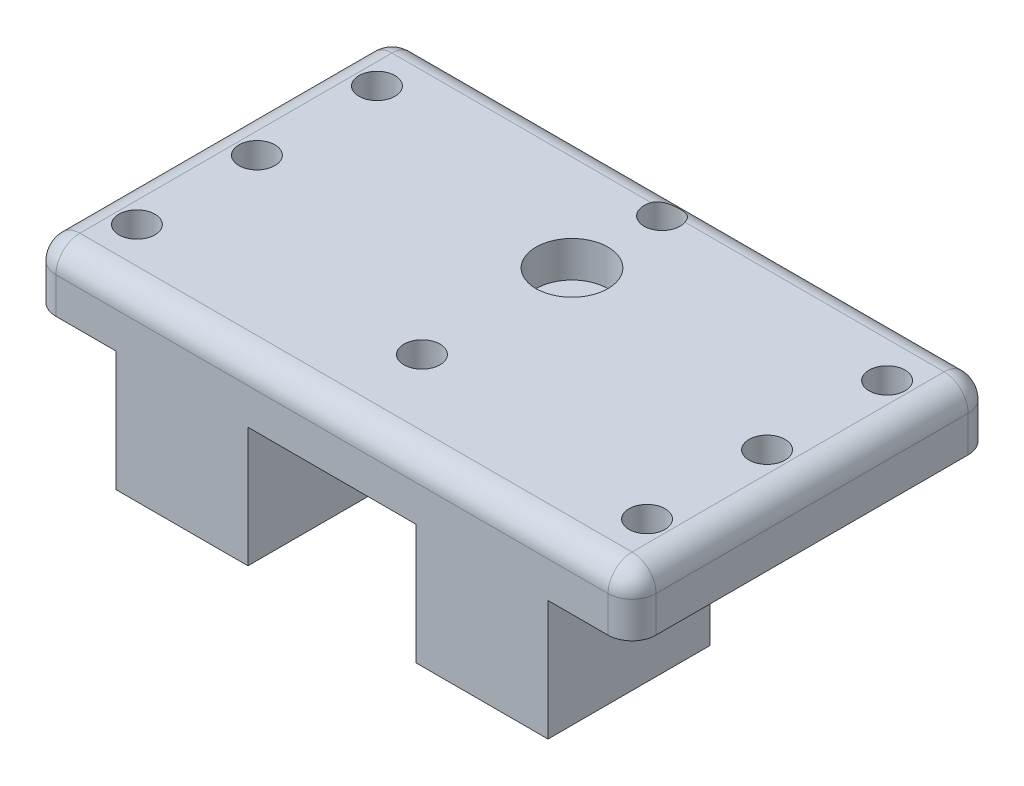
ISO-10303-21;
HEADER;
FILE_DESCRIPTION(('STEP AP214'),'2;1');
FILE_NAME('part.step','',(''),(''),'','','');
FILE_SCHEMA(('AUTOMOTIVE_DESIGN { 1 0 10303 214 1 1 1 1 }'));
ENDSEC;
DATA;
#1=APPLICATION_CONTEXT('core data for automotive mechanical design processes');
#2=APPLICATION_PROTOCOL_DEFINITION('international standard','automotive_design',2000,#1);
#3=PRODUCT_CONTEXT('',#1,'mechanical');
#4=PRODUCT('Part','Part','',(#3));
#5=PRODUCT_RELATED_PRODUCT_CATEGORY('part','',(#4));
#6=PRODUCT_DEFINITION_FORMATION('','',#4);
#7=PRODUCT_DEFINITION_CONTEXT('part definition',#1,'design');
#8=PRODUCT_DEFINITION('design','',#6,#7);
#9=PRODUCT_DEFINITION_SHAPE('','',#8);
#10=(LENGTH_UNIT() NAMED_UNIT(*) SI_UNIT(.MILLI.,.METRE.));
#11=(NAMED_UNIT(*) PLANE_ANGLE_UNIT() SI_UNIT($,.RADIAN.));
#12=(NAMED_UNIT(*) SI_UNIT($,.STERADIAN.) SOLID_ANGLE_UNIT());
#13=UNCERTAINTY_MEASURE_WITH_UNIT(LENGTH_MEASURE(1.E-05),#10,'distance_accuracy_value','');
#14=(GEOMETRIC_REPRESENTATION_CONTEXT(3) GLOBAL_UNCERTAINTY_ASSIGNED_CONTEXT((#13)) GLOBAL_UNIT_ASSIGNED_CONTEXT((#10,
#11,#12)) REPRESENTATION_CONTEXT('',''));
#15=CARTESIAN_POINT('',(0.,0.,0.));
#16=DIRECTION('',(0.,0.,1.));
#17=DIRECTION('',(1.,0.,0.));
#18=AXIS2_PLACEMENT_3D('',#15,#16,#17);
#19=CARTESIAN_POINT('',(0.,0.,-5.));
#20=DIRECTION('',(0.,1.,0.));
#21=DIRECTION('',(0.,0.,1.));
#22=AXIS2_PLACEMENT_3D('',#19,#20,#21);
#23=CYLINDRICAL_SURFACE('',#22,1.25);
#24=CARTESIAN_POINT('',(0.,0.,-5.));
#25=DIRECTION('',(0.,1.,0.));
#26=DIRECTION('',(0.,0.,1.));
#27=AXIS2_PLACEMENT_3D('',#24,#25,#26);
#28=CIRCLE('',#27,1.25);
#29=CARTESIAN_POINT('',(0.,0.,-3.75));
#30=VERTEX_POINT('',#29);
#31=EDGE_CURVE('E429',#30,#30,#28,.T.);
#32=ORIENTED_EDGE('',*,*,#31,.F.);
#33=EDGE_LOOP('',(#32));
#34=FACE_BOUND('',#33,.T.);
#35=CARTESIAN_POINT('',(0.,2.,-5.));
#36=DIRECTION('',(0.,1.,0.));
#37=DIRECTION('',(0.,0.,1.));
#38=AXIS2_PLACEMENT_3D('',#35,#36,#37);
#39=CIRCLE('',#38,1.25);
#40=CARTESIAN_POINT('',(0.,2.,-3.75));
#41=VERTEX_POINT('',#40);
#42=EDGE_CURVE('E45',#41,#41,#39,.F.);
#43=ORIENTED_EDGE('',*,*,#42,.F.);
#44=EDGE_LOOP('',(#43));
#45=FACE_BOUND('',#44,.T.);
#46=ADVANCED_FACE('F41',(#34,#45),#23,.F.);
#47=CARTESIAN_POINT('',(0.,0.,0.));
#48=DIRECTION('',(0.,1.,0.));
#49=DIRECTION('',(0.,0.,1.));
#50=AXIS2_PLACEMENT_3D('',#47,#48,#49);
#51=PLANE('',#50);
#52=CARTESIAN_POINT('',(-21.25,0.,-9.99999999999999));
#53=DIRECTION('',(0.,1.,0.));
#54=DIRECTION('',(0.,0.,1.));
#55=AXIS2_PLACEMENT_3D('',#52,#53,#54);
#56=CIRCLE('',#55,1.5);
#57=CARTESIAN_POINT('',(-21.25,0.,-8.49999999999999));
#58=VERTEX_POINT('',#57);
#59=EDGE_CURVE('E380',#58,#58,#56,.T.);
#60=ORIENTED_EDGE('',*,*,#59,.T.);
#61=EDGE_LOOP('',(#60));
#62=FACE_BOUND('',#61,.T.);
#63=CARTESIAN_POINT('',(21.25,0.,10.));
#64=DIRECTION('',(0.,1.,0.));
#65=DIRECTION('',(0.,0.,1.));
#66=AXIS2_PLACEMENT_3D('',#63,#64,#65);
#67=CIRCLE('',#66,1.5);
#68=CARTESIAN_POINT('',(21.25,0.,11.5));
#69=VERTEX_POINT('',#68);
#70=EDGE_CURVE('E377',#69,#69,#67,.T.);
#71=ORIENTED_EDGE('',*,*,#70,.T.);
#72=EDGE_LOOP('',(#71));
#73=FACE_BOUND('',#72,.T.);
#74=CARTESIAN_POINT('',(21.25,0.,-9.99999999999999));
#75=DIRECTION('',(0.,1.,0.));
#76=DIRECTION('',(0.,0.,1.));
#77=AXIS2_PLACEMENT_3D('',#74,#75,#76);
#78=CIRCLE('',#77,1.5);
#79=CARTESIAN_POINT('',(21.25,0.,-8.49999999999999));
#80=VERTEX_POINT('',#79);
#81=EDGE_CURVE('E374',#80,#80,#78,.T.);
#82=ORIENTED_EDGE('',*,*,#81,.T.);
#83=EDGE_LOOP('',(#82));
#84=FACE_BOUND('',#83,.T.);
#85=CARTESIAN_POINT('',(-21.25,0.,10.));
#86=DIRECTION('',(0.,1.,0.));
#87=DIRECTION('',(0.,0.,1.));
#88=AXIS2_PLACEMENT_3D('',#85,#86,#87);
#89=CIRCLE('',#88,1.5);
#90=CARTESIAN_POINT('',(-21.25,0.,11.5));
#91=VERTEX_POINT('',#90);
#92=EDGE_CURVE('E371',#91,#91,#89,.T.);
#93=ORIENTED_EDGE('',*,*,#92,.T.);
#94=EDGE_LOOP('',(#93));
#95=FACE_BOUND('',#94,.T.);
#96=CARTESIAN_POINT('',(-21.25,0.,0.));
#97=DIRECTION('',(0.,-1.,0.));
#98=DIRECTION('',(0.,0.,-1.));
#99=AXIS2_PLACEMENT_3D('',#96,#97,#98);
#100=CIRCLE('',#99,1.5);
#101=CARTESIAN_POINT('',(-21.25,0.,-1.5));
#102=VERTEX_POINT('',#101);
#103=EDGE_CURVE('E430',#102,#102,#100,.T.);
#104=ORIENTED_EDGE('',*,*,#103,.F.);
#105=EDGE_LOOP('',(#104));
#106=FACE_BOUND('',#105,.T.);
#107=CARTESIAN_POINT('',(0.,0.,7.5));
#108=DIRECTION('',(0.,-1.,0.));
#109=DIRECTION('',(0.,0.,-1.));
#110=AXIS2_PLACEMENT_3D('',#107,#108,#109);
#111=CIRCLE('',#110,1.5);
#112=CARTESIAN_POINT('',(0.,0.,6.));
#113=VERTEX_POINT('',#112);
#114=EDGE_CURVE('E433',#113,#113,#111,.T.);
#115=ORIENTED_EDGE('',*,*,#114,.F.);
#116=EDGE_LOOP('',(#115));
#117=FACE_BOUND('',#116,.T.);
#118=CARTESIAN_POINT('',(21.25,0.,0.));
#119=DIRECTION('',(0.,-1.,0.));
#120=DIRECTION('',(0.,0.,-1.));
#121=AXIS2_PLACEMENT_3D('',#118,#119,#120);
#122=CIRCLE('',#121,1.5);
#123=CARTESIAN_POINT('',(21.25,0.,-1.5));
#124=VERTEX_POINT('',#123);
#125=EDGE_CURVE('E439',#124,#124,#122,.T.);
#126=ORIENTED_EDGE('',*,*,#125,.F.);
#127=EDGE_LOOP('',(#126));
#128=FACE_BOUND('',#127,.T.);
#129=CARTESIAN_POINT('',(0.,0.,-12.5));
#130=DIRECTION('',(0.,-1.,0.));
#131=DIRECTION('',(0.,0.,-1.));
#132=AXIS2_PLACEMENT_3D('',#129,#130,#131);
#133=CIRCLE('',#132,1.5);
#134=CARTESIAN_POINT('',(0.,0.,-14.));
#135=VERTEX_POINT('',#134);
#136=EDGE_CURVE('E445',#135,#135,#133,.T.);
#137=ORIENTED_EDGE('',*,*,#136,.F.);
#138=EDGE_LOOP('',(#137));
#139=FACE_BOUND('',#138,.T.);
#140=ORIENTED_EDGE('',*,*,#31,.T.);
#141=EDGE_LOOP('',(#140));
#142=FACE_BOUND('',#141,.T.);
#143=DIRECTION('',(0.,0.,1.));
#144=VECTOR('',#143,1.);
#145=CARTESIAN_POINT('',(-25.,0.,15.));
#146=LINE('',#145,#144);
#147=CARTESIAN_POINT('',(-25.,0.,-13.));
#148=VERTEX_POINT('',#147);
#149=CARTESIAN_POINT('',(-25.,0.,13.));
#150=VERTEX_POINT('',#149);
#151=EDGE_CURVE('E203',#148,#150,#146,.T.);
#152=ORIENTED_EDGE('',*,*,#151,.F.);
#153=CARTESIAN_POINT('',(-23.,0.,-13.));
#154=DIRECTION('',(0.,1.,0.));
#155=DIRECTION('',(0.,0.,1.));
#156=AXIS2_PLACEMENT_3D('',#153,#154,#155);
#157=CIRCLE('',#156,2.);
#158=CARTESIAN_POINT('',(-23.,0.,-15.));
#159=VERTEX_POINT('',#158);
#160=EDGE_CURVE('E314',#148,#159,#157,.F.);
#161=ORIENTED_EDGE('',*,*,#160,.T.);
#162=DIRECTION('',(-1.,0.,0.));
#163=VECTOR('',#162,1.);
#164=CARTESIAN_POINT('',(25.,0.,-15.));
#165=LINE('',#164,#163);
#166=CARTESIAN_POINT('',(23.,0.,-15.));
#167=VERTEX_POINT('',#166);
#168=EDGE_CURVE('E209',#167,#159,#165,.T.);
#169=ORIENTED_EDGE('',*,*,#168,.F.);
#170=CARTESIAN_POINT('',(23.,0.,-13.));
#171=DIRECTION('',(0.,1.,0.));
#172=DIRECTION('',(0.,0.,1.));
#173=AXIS2_PLACEMENT_3D('',#170,#171,#172);
#174=CIRCLE('',#173,2.);
#175=CARTESIAN_POINT('',(25.,0.,-13.));
#176=VERTEX_POINT('',#175);
#177=EDGE_CURVE('E299',#167,#176,#174,.F.);
#178=ORIENTED_EDGE('',*,*,#177,.T.);
#179=DIRECTION('',(0.,0.,-1.));
#180=VECTOR('',#179,1.);
#181=CARTESIAN_POINT('',(25.,0.,15.));
#182=LINE('',#181,#180);
#183=CARTESIAN_POINT('',(25.,0.,13.));
#184=VERTEX_POINT('',#183);
#185=EDGE_CURVE('E202',#184,#176,#182,.T.);
#186=ORIENTED_EDGE('',*,*,#185,.F.);
#187=CARTESIAN_POINT('',(23.,0.,13.));
#188=DIRECTION('',(0.,1.,0.));
#189=DIRECTION('',(0.,0.,1.));
#190=AXIS2_PLACEMENT_3D('',#187,#188,#189);
#191=CIRCLE('',#190,2.);
#192=CARTESIAN_POINT('',(23.,0.,15.));
#193=VERTEX_POINT('',#192);
#194=EDGE_CURVE('E304',#184,#193,#191,.F.);
#195=ORIENTED_EDGE('',*,*,#194,.T.);
#196=DIRECTION('',(1.,0.,0.));
#197=VECTOR('',#196,1.);
#198=CARTESIAN_POINT('',(25.,0.,15.));
#199=LINE('',#198,#197);
#200=CARTESIAN_POINT('',(18.,0.,15.));
#201=VERTEX_POINT('',#200);
#202=EDGE_CURVE('E200',#201,#193,#199,.T.);
#203=ORIENTED_EDGE('',*,*,#202,.F.);
#204=DIRECTION('',(0.,0.,1.));
#205=VECTOR('',#204,1.);
#206=CARTESIAN_POINT('',(18.,0.,1.5));
#207=LINE('',#206,#205);
#208=CARTESIAN_POINT('',(18.,0.,1.5));
#209=VERTEX_POINT('',#208);
#210=EDGE_CURVE('E389',#209,#201,#207,.T.);
#211=ORIENTED_EDGE('',*,*,#210,.F.);
#212=DIRECTION('',(1.,0.,0.));
#213=VECTOR('',#212,1.);
#214=CARTESIAN_POINT('',(7.,0.,1.5));
#215=LINE('',#214,#213);
#216=CARTESIAN_POINT('',(7.,0.,1.5));
#217=VERTEX_POINT('',#216);
#218=EDGE_CURVE('E191',#217,#209,#215,.T.);
#219=ORIENTED_EDGE('',*,*,#218,.F.);
#220=DIRECTION('',(0.,0.,-1.));
#221=VECTOR('',#220,1.);
#222=CARTESIAN_POINT('',(7.,0.,1.5));
#223=LINE('',#222,#221);
#224=CARTESIAN_POINT('',(7.,0.,15.));
#225=VERTEX_POINT('',#224);
#226=EDGE_CURVE('E176',#225,#217,#223,.T.);
#227=ORIENTED_EDGE('',*,*,#226,.F.);
#228=CARTESIAN_POINT('',(-7.,0.,15.));
#229=VERTEX_POINT('',#228);
#230=EDGE_CURVE('E188',#229,#225,#199,.T.);
#231=ORIENTED_EDGE('',*,*,#230,.F.);
#232=DIRECTION('',(0.,0.,1.));
#233=VECTOR('',#232,1.);
#234=CARTESIAN_POINT('',(-7.,0.,1.5));
#235=LINE('',#234,#233);
#236=CARTESIAN_POINT('',(-7.,0.,1.5));
#237=VERTEX_POINT('',#236);
#238=EDGE_CURVE('E412',#237,#229,#235,.T.);
#239=ORIENTED_EDGE('',*,*,#238,.F.);
#240=DIRECTION('',(1.,0.,0.));
#241=VECTOR('',#240,1.);
#242=CARTESIAN_POINT('',(-7.,0.,1.5));
#243=LINE('',#242,#241);
#244=CARTESIAN_POINT('',(-18.,0.,1.5));
#245=VERTEX_POINT('',#244);
#246=EDGE_CURVE('E192',#245,#237,#243,.T.);
#247=ORIENTED_EDGE('',*,*,#246,.F.);
#248=DIRECTION('',(0.,0.,-1.));
#249=VECTOR('',#248,1.);
#250=CARTESIAN_POINT('',(-18.,0.,1.5));
#251=LINE('',#250,#249);
#252=CARTESIAN_POINT('',(-18.,0.,15.));
#253=VERTEX_POINT('',#252);
#254=EDGE_CURVE('E403',#253,#245,#251,.T.);
#255=ORIENTED_EDGE('',*,*,#254,.F.);
#256=CARTESIAN_POINT('',(-23.,0.,15.));
#257=VERTEX_POINT('',#256);
#258=EDGE_CURVE('E199',#257,#253,#199,.T.);
#259=ORIENTED_EDGE('',*,*,#258,.F.);
#260=CARTESIAN_POINT('',(-23.,0.,13.));
#261=DIRECTION('',(0.,1.,0.));
#262=DIRECTION('',(0.,0.,1.));
#263=AXIS2_PLACEMENT_3D('',#260,#261,#262);
#264=CIRCLE('',#263,2.);
#265=EDGE_CURVE('E307',#257,#150,#264,.F.);
#266=ORIENTED_EDGE('',*,*,#265,.T.);
#267=EDGE_LOOP('',(#152,#161,#169,#178,#186,#195,#203,#211,#219,#227,#231,#239,#247,#255,#259,#266));
#268=FACE_BOUND('',#267,.T.);
#269=ADVANCED_FACE('F187',(#62,#73,#84,#95,#106,#117,#128,#139,#142,#268),#51,.F.);
#270=CARTESIAN_POINT('',(-25.,5.,15.));
#271=DIRECTION('',(1.,0.,0.));
#272=DIRECTION('',(0.,0.,-1.));
#273=AXIS2_PLACEMENT_3D('',#270,#271,#272);
#274=PLANE('',#273);
#275=DIRECTION('',(0.,0.,1.));
#276=VECTOR('',#275,1.);
#277=CARTESIAN_POINT('',(-25.,3.,-15.));
#278=LINE('',#277,#276);
#279=CARTESIAN_POINT('',(-25.,3.,13.));
#280=VERTEX_POINT('',#279);
#281=CARTESIAN_POINT('',(-25.,3.,-13.));
#282=VERTEX_POINT('',#281);
#283=EDGE_CURVE('E309',#280,#282,#278,.F.);
#284=ORIENTED_EDGE('',*,*,#283,.T.);
#285=DIRECTION('',(0.,-1.,0.));
#286=VECTOR('',#285,1.);
#287=CARTESIAN_POINT('',(-25.,5.,-13.));
#288=LINE('',#287,#286);
#289=EDGE_CURVE('E305',#282,#148,#288,.T.);
#290=ORIENTED_EDGE('',*,*,#289,.T.);
#291=ORIENTED_EDGE('',*,*,#151,.T.);
#292=DIRECTION('',(0.,-1.,0.));
#293=VECTOR('',#292,1.);
#294=CARTESIAN_POINT('',(-25.,5.,13.));
#295=LINE('',#294,#293);
#296=EDGE_CURVE('E454',#150,#280,#295,.F.);
#297=ORIENTED_EDGE('',*,*,#296,.T.);
#298=EDGE_LOOP('',(#284,#290,#291,#297));
#299=FACE_BOUND('',#298,.T.);
#300=ADVANCED_FACE('F262',(#299),#274,.F.);
#301=CARTESIAN_POINT('',(25.,5.,15.));
#302=DIRECTION('',(0.,0.,-1.));
#303=DIRECTION('',(-1.,0.,0.));
#304=AXIS2_PLACEMENT_3D('',#301,#302,#303);
#305=PLANE('',#304);
#306=DIRECTION('',(1.,0.,0.));
#307=VECTOR('',#306,1.);
#308=CARTESIAN_POINT('',(-25.,3.,15.));
#309=LINE('',#308,#307);
#310=CARTESIAN_POINT('',(23.,3.,15.));
#311=VERTEX_POINT('',#310);
#312=CARTESIAN_POINT('',(-23.,3.,15.));
#313=VERTEX_POINT('',#312);
#314=EDGE_CURVE('E50',#311,#313,#309,.F.);
#315=ORIENTED_EDGE('',*,*,#314,.T.);
#316=DIRECTION('',(0.,-1.,0.));
#317=VECTOR('',#316,1.);
#318=CARTESIAN_POINT('',(-23.,5.,15.));
#319=LINE('',#318,#317);
#320=EDGE_CURVE('E11',#313,#257,#319,.T.);
#321=ORIENTED_EDGE('',*,*,#320,.T.);
#322=ORIENTED_EDGE('',*,*,#258,.T.);
#323=DIRECTION('',(0.,1.,0.));
#324=VECTOR('',#323,1.);
#325=CARTESIAN_POINT('',(-18.,-10.,15.));
#326=LINE('',#325,#324);
#327=CARTESIAN_POINT('',(-18.,-10.,15.));
#328=VERTEX_POINT('',#327);
#329=EDGE_CURVE('E418',#328,#253,#326,.T.);
#330=ORIENTED_EDGE('',*,*,#329,.F.);
#331=DIRECTION('',(-1.,0.,0.));
#332=VECTOR('',#331,1.);
#333=CARTESIAN_POINT('',(-7.,-10.,15.));
#334=LINE('',#333,#332);
#335=CARTESIAN_POINT('',(-7.,-10.,15.));
#336=VERTEX_POINT('',#335);
#337=EDGE_CURVE('E405',#336,#328,#334,.T.);
#338=ORIENTED_EDGE('',*,*,#337,.F.);
#339=DIRECTION('',(0.,1.,0.));
#340=VECTOR('',#339,1.);
#341=CARTESIAN_POINT('',(-7.,-10.,15.));
#342=LINE('',#341,#340);
#343=EDGE_CURVE('E198',#336,#229,#342,.T.);
#344=ORIENTED_EDGE('',*,*,#343,.T.);
#345=ORIENTED_EDGE('',*,*,#230,.T.);
#346=DIRECTION('',(0.,1.,0.));
#347=VECTOR('',#346,1.);
#348=CARTESIAN_POINT('',(7.,-10.,15.));
#349=LINE('',#348,#347);
#350=CARTESIAN_POINT('',(7.,-10.,15.));
#351=VERTEX_POINT('',#350);
#352=EDGE_CURVE('E172',#351,#225,#349,.T.);
#353=ORIENTED_EDGE('',*,*,#352,.F.);
#354=DIRECTION('',(-1.,0.,0.));
#355=VECTOR('',#354,1.);
#356=CARTESIAN_POINT('',(7.,-10.,15.));
#357=LINE('',#356,#355);
#358=CARTESIAN_POINT('',(18.,-10.,15.));
#359=VERTEX_POINT('',#358);
#360=EDGE_CURVE('E182',#359,#351,#357,.T.);
#361=ORIENTED_EDGE('',*,*,#360,.F.);
#362=DIRECTION('',(0.,1.,0.));
#363=VECTOR('',#362,1.);
#364=CARTESIAN_POINT('',(18.,-10.,15.));
#365=LINE('',#364,#363);
#366=EDGE_CURVE('E183',#359,#201,#365,.T.);
#367=ORIENTED_EDGE('',*,*,#366,.T.);
#368=ORIENTED_EDGE('',*,*,#202,.T.);
#369=DIRECTION('',(0.,-1.,0.));
#370=VECTOR('',#369,1.);
#371=CARTESIAN_POINT('',(23.,5.,15.));
#372=LINE('',#371,#370);
#373=EDGE_CURVE('E61',#193,#311,#372,.F.);
#374=ORIENTED_EDGE('',*,*,#373,.T.);
#375=EDGE_LOOP('',(#315,#321,#322,#330,#338,#344,#345,#353,#361,#367,#368,#374));
#376=FACE_BOUND('',#375,.T.);
#377=ADVANCED_FACE('F195',(#376),#305,.F.);
#378=CARTESIAN_POINT('',(25.,5.,15.));
#379=DIRECTION('',(-1.,0.,0.));
#380=DIRECTION('',(0.,0.,1.));
#381=AXIS2_PLACEMENT_3D('',#378,#379,#380);
#382=PLANE('',#381);
#383=DIRECTION('',(0.,0.,-1.));
#384=VECTOR('',#383,1.);
#385=CARTESIAN_POINT('',(25.,3.,15.));
#386=LINE('',#385,#384);
#387=CARTESIAN_POINT('',(25.,3.,-13.));
#388=VERTEX_POINT('',#387);
#389=CARTESIAN_POINT('',(25.,3.,13.));
#390=VERTEX_POINT('',#389);
#391=EDGE_CURVE('E225',#388,#390,#386,.F.);
#392=ORIENTED_EDGE('',*,*,#391,.T.);
#393=DIRECTION('',(0.,-1.,0.));
#394=VECTOR('',#393,1.);
#395=CARTESIAN_POINT('',(25.,5.,13.));
#396=LINE('',#395,#394);
#397=EDGE_CURVE('E228',#390,#184,#396,.T.);
#398=ORIENTED_EDGE('',*,*,#397,.T.);
#399=ORIENTED_EDGE('',*,*,#185,.T.);
#400=DIRECTION('',(0.,-1.,0.));
#401=VECTOR('',#400,1.);
#402=CARTESIAN_POINT('',(25.,5.,-13.));
#403=LINE('',#402,#401);
#404=EDGE_CURVE('E223',#176,#388,#403,.F.);
#405=ORIENTED_EDGE('',*,*,#404,.T.);
#406=EDGE_LOOP('',(#392,#398,#399,#405));
#407=FACE_BOUND('',#406,.T.);
#408=ADVANCED_FACE('F266',(#407),#382,.F.);
#409=CARTESIAN_POINT('',(25.,5.,-15.));
#410=DIRECTION('',(0.,0.,1.));
#411=DIRECTION('',(1.,0.,0.));
#412=AXIS2_PLACEMENT_3D('',#409,#410,#411);
#413=PLANE('',#412);
#414=ORIENTED_EDGE('',*,*,#168,.T.);
#415=DIRECTION('',(0.,-1.,0.));
#416=VECTOR('',#415,1.);
#417=CARTESIAN_POINT('',(-23.,5.,-15.));
#418=LINE('',#417,#416);
#419=CARTESIAN_POINT('',(-23.,3.,-15.));
#420=VERTEX_POINT('',#419);
#421=EDGE_CURVE('E460',#159,#420,#418,.F.);
#422=ORIENTED_EDGE('',*,*,#421,.T.);
#423=DIRECTION('',(-1.,0.,0.));
#424=VECTOR('',#423,1.);
#425=CARTESIAN_POINT('',(25.,3.,-15.));
#426=LINE('',#425,#424);
#427=CARTESIAN_POINT('',(23.,3.,-15.));
#428=VERTEX_POINT('',#427);
#429=EDGE_CURVE('E462',#420,#428,#426,.F.);
#430=ORIENTED_EDGE('',*,*,#429,.T.);
#431=DIRECTION('',(0.,-1.,0.));
#432=VECTOR('',#431,1.);
#433=CARTESIAN_POINT('',(23.,5.,-15.));
#434=LINE('',#433,#432);
#435=EDGE_CURVE('E238',#428,#167,#434,.T.);
#436=ORIENTED_EDGE('',*,*,#435,.T.);
#437=EDGE_LOOP('',(#414,#422,#430,#436));
#438=FACE_BOUND('',#437,.T.);
#439=ADVANCED_FACE('F258',(#438),#413,.F.);
#440=CARTESIAN_POINT('',(0.,5.,0.));
#441=DIRECTION('',(0.,1.,0.));
#442=DIRECTION('',(0.,0.,1.));
#443=AXIS2_PLACEMENT_3D('',#440,#441,#442);
#444=PLANE('',#443);
#445=CARTESIAN_POINT('',(0.,5.,-5.));
#446=DIRECTION('',(0.,1.,0.));
#447=DIRECTION('',(0.,0.,1.));
#448=AXIS2_PLACEMENT_3D('',#445,#446,#447);
#449=CIRCLE('',#448,3.);
#450=CARTESIAN_POINT('',(0.,5.,-2.));
#451=VERTEX_POINT('',#450);
#452=EDGE_CURVE('E364',#451,#451,#449,.T.);
#453=ORIENTED_EDGE('',*,*,#452,.F.);
#454=EDGE_LOOP('',(#453));
#455=FACE_BOUND('',#454,.T.);
#456=CARTESIAN_POINT('',(-21.25,5.,-9.99999999999999));
#457=DIRECTION('',(0.,1.,0.));
#458=DIRECTION('',(0.,0.,-1.));
#459=AXIS2_PLACEMENT_3D('',#456,#457,#458);
#460=CIRCLE('',#459,1.5);
#461=CARTESIAN_POINT('',(-21.25,5.,-11.5));
#462=VERTEX_POINT('',#461);
#463=EDGE_CURVE('E360',#462,#462,#460,.T.);
#464=ORIENTED_EDGE('',*,*,#463,.F.);
#465=EDGE_LOOP('',(#464));
#466=FACE_BOUND('',#465,.T.);
#467=CARTESIAN_POINT('',(21.25,5.,10.));
#468=DIRECTION('',(0.,1.,0.));
#469=DIRECTION('',(0.,0.,-1.));
#470=AXIS2_PLACEMENT_3D('',#467,#468,#469);
#471=CIRCLE('',#470,1.5);
#472=CARTESIAN_POINT('',(21.25,5.,8.5));
#473=VERTEX_POINT('',#472);
#474=EDGE_CURVE('E355',#473,#473,#471,.T.);
#475=ORIENTED_EDGE('',*,*,#474,.F.);
#476=EDGE_LOOP('',(#475));
#477=FACE_BOUND('',#476,.T.);
#478=CARTESIAN_POINT('',(21.25,5.,-9.99999999999999));
#479=DIRECTION('',(0.,1.,0.));
#480=DIRECTION('',(0.,0.,1.));
#481=AXIS2_PLACEMENT_3D('',#478,#479,#480);
#482=CIRCLE('',#481,1.5);
#483=CARTESIAN_POINT('',(21.25,5.,-8.49999999999999));
#484=VERTEX_POINT('',#483);
#485=EDGE_CURVE('E350',#484,#484,#482,.T.);
#486=ORIENTED_EDGE('',*,*,#485,.F.);
#487=EDGE_LOOP('',(#486));
#488=FACE_BOUND('',#487,.T.);
#489=CARTESIAN_POINT('',(-21.25,5.,10.));
#490=DIRECTION('',(0.,1.,0.));
#491=DIRECTION('',(0.,0.,1.));
#492=AXIS2_PLACEMENT_3D('',#489,#490,#491);
#493=CIRCLE('',#492,1.5);
#494=CARTESIAN_POINT('',(-21.25,5.,11.5));
#495=VERTEX_POINT('',#494);
#496=EDGE_CURVE('E367',#495,#495,#493,.T.);
#497=ORIENTED_EDGE('',*,*,#496,.F.);
#498=EDGE_LOOP('',(#497));
#499=FACE_BOUND('',#498,.T.);
#500=CARTESIAN_POINT('',(-21.25,5.,0.));
#501=DIRECTION('',(0.,-1.,0.));
#502=DIRECTION('',(0.,0.,-1.));
#503=AXIS2_PLACEMENT_3D('',#500,#501,#502);
#504=CIRCLE('',#503,1.5);
#505=CARTESIAN_POINT('',(-21.25,5.,-1.5));
#506=VERTEX_POINT('',#505);
#507=EDGE_CURVE('E426',#506,#506,#504,.T.);
#508=ORIENTED_EDGE('',*,*,#507,.T.);
#509=EDGE_LOOP('',(#508));
#510=FACE_BOUND('',#509,.T.);
#511=CARTESIAN_POINT('',(0.,5.,7.5));
#512=DIRECTION('',(0.,-1.,0.));
#513=DIRECTION('',(0.,0.,-1.));
#514=AXIS2_PLACEMENT_3D('',#511,#512,#513);
#515=CIRCLE('',#514,1.5);
#516=CARTESIAN_POINT('',(0.,5.,6.));
#517=VERTEX_POINT('',#516);
#518=EDGE_CURVE('E436',#517,#517,#515,.T.);
#519=ORIENTED_EDGE('',*,*,#518,.T.);
#520=EDGE_LOOP('',(#519));
#521=FACE_BOUND('',#520,.T.);
#522=CARTESIAN_POINT('',(21.25,5.,0.));
#523=DIRECTION('',(0.,-1.,0.));
#524=DIRECTION('',(0.,0.,-1.));
#525=AXIS2_PLACEMENT_3D('',#522,#523,#524);
#526=CIRCLE('',#525,1.5);
#527=CARTESIAN_POINT('',(21.25,5.,-1.5));
#528=VERTEX_POINT('',#527);
#529=EDGE_CURVE('E442',#528,#528,#526,.T.);
#530=ORIENTED_EDGE('',*,*,#529,.T.);
#531=EDGE_LOOP('',(#530));
#532=FACE_BOUND('',#531,.T.);
#533=DIRECTION('',(0.,0.,-1.));
#534=VECTOR('',#533,1.);
#535=CARTESIAN_POINT('',(23.,5.,-15.));
#536=LINE('',#535,#534);
#537=CARTESIAN_POINT('',(23.,5.,13.));
#538=VERTEX_POINT('',#537);
#539=CARTESIAN_POINT('',(23.,5.,-13.));
#540=VERTEX_POINT('',#539);
#541=EDGE_CURVE('E218',#538,#540,#536,.T.);
#542=ORIENTED_EDGE('',*,*,#541,.T.);
#543=DIRECTION('',(-1.,0.,0.));
#544=VECTOR('',#543,1.);
#545=CARTESIAN_POINT('',(-25.,5.,-13.));
#546=LINE('',#545,#544);
#547=CARTESIAN_POINT('',(1.4142135623731,5.,-13.));
#548=VERTEX_POINT('',#547);
#549=EDGE_CURVE('E221',#540,#548,#546,.T.);
#550=ORIENTED_EDGE('',*,*,#549,.T.);
#551=CARTESIAN_POINT('',(0.,5.,-12.5));
#552=DIRECTION('',(0.,-1.,0.));
#553=DIRECTION('',(0.,0.,-1.));
#554=AXIS2_PLACEMENT_3D('',#551,#552,#553);
#555=CIRCLE('',#554,1.5);
#556=CARTESIAN_POINT('',(-1.41421356237309,5.,-13.));
#557=VERTEX_POINT('',#556);
#558=EDGE_CURVE('E425',#548,#557,#555,.T.);
#559=ORIENTED_EDGE('',*,*,#558,.T.);
#560=DIRECTION('',(-1.,0.,0.));
#561=VECTOR('',#560,1.);
#562=CARTESIAN_POINT('',(-25.,5.,-13.));
#563=LINE('',#562,#561);
#564=CARTESIAN_POINT('',(-23.,5.,-13.));
#565=VERTEX_POINT('',#564);
#566=EDGE_CURVE('E216',#557,#565,#563,.T.);
#567=ORIENTED_EDGE('',*,*,#566,.T.);
#568=DIRECTION('',(0.,0.,1.));
#569=VECTOR('',#568,1.);
#570=CARTESIAN_POINT('',(-23.,5.,15.));
#571=LINE('',#570,#569);
#572=CARTESIAN_POINT('',(-23.,5.,13.));
#573=VERTEX_POINT('',#572);
#574=EDGE_CURVE('E214',#565,#573,#571,.T.);
#575=ORIENTED_EDGE('',*,*,#574,.T.);
#576=DIRECTION('',(1.,0.,0.));
#577=VECTOR('',#576,1.);
#578=CARTESIAN_POINT('',(25.,5.,13.));
#579=LINE('',#578,#577);
#580=EDGE_CURVE('E212',#573,#538,#579,.T.);
#581=ORIENTED_EDGE('',*,*,#580,.T.);
#582=EDGE_LOOP('',(#542,#550,#559,#567,#575,#581));
#583=FACE_BOUND('',#582,.T.);
#584=ADVANCED_FACE('F250',(#455,#466,#477,#488,#499,#510,#521,#532,#583),#444,.T.);
#585=CARTESIAN_POINT('',(0.,5.,-12.5));
#586=DIRECTION('',(0.,-1.,0.));
#587=DIRECTION('',(0.,0.,-1.));
#588=AXIS2_PLACEMENT_3D('',#585,#586,#587);
#589=CYLINDRICAL_SURFACE('',#588,1.5);
#590=ORIENTED_EDGE('',*,*,#558,.F.);
#591=CARTESIAN_POINT('',(1.4142135623731,5.,-13.));
#592=CARTESIAN_POINT('',(1.40097388923635,5.00000425427285,-13.0374579816489));
#593=CARTESIAN_POINT('',(1.38624894151197,4.99894716578043,-13.0743583947965));
#594=CARTESIAN_POINT('',(1.35398271369799,4.99493648310508,-13.1467601415856));
#595=CARTESIAN_POINT('',(1.33644410598798,4.99198468059268,-13.1822627633738));
#596=CARTESIAN_POINT('',(1.28005990183859,4.98067529321354,-13.2858701857252));
#597=CARTESIAN_POINT('',(1.23725747018488,4.96985736542155,-13.3516027165144));
#598=CARTESIAN_POINT('',(1.14270019343597,4.9438408593464,-13.4748149447209));
#599=CARTESIAN_POINT('',(1.09097476848163,4.92865657105467,-13.5323206616015));
#600=CARTESIAN_POINT('',(0.979592241137274,4.89613396086694,-13.6385667796228));
#601=CARTESIAN_POINT('',(0.919918777561204,4.87879120067876,-13.6872885984814));
#602=CARTESIAN_POINT('',(0.787771974869038,4.84266891165827,-13.7792567180619));
#603=CARTESIAN_POINT('',(0.714621083358701,4.82390955783459,-13.8215419445704));
#604=CARTESIAN_POINT('',(0.561620501730947,4.78978468626863,-13.8934548193922));
#605=CARTESIAN_POINT('',(0.481775322452767,4.77441690812946,-13.9230909104028));
#606=CARTESIAN_POINT('',(0.317918567740798,4.75012731556095,-13.9683603433003));
#607=CARTESIAN_POINT('',(0.233946603573628,4.74115358931954,-13.9841067075598));
#608=CARTESIAN_POINT('',(0.0641125456825553,4.73147548338832,-14.001050035482));
#609=CARTESIAN_POINT('',(-0.0217474096477969,4.73076218682081,-14.0022626878854));
#610=CARTESIAN_POINT('',(-0.181284890556884,4.73729163307443,-13.9908776262482));
#611=CARTESIAN_POINT('',(-0.255135786145522,4.74354447192534,-13.9799986255347));
#612=CARTESIAN_POINT('',(-0.399812728452243,4.7613415604065,-13.9476356491382));
#613=CARTESIAN_POINT('',(-0.470637334956187,4.77288829941322,-13.9261466839139));
#614=CARTESIAN_POINT('',(-0.609961847769096,4.79991768497196,-13.8724799871838));
#615=CARTESIAN_POINT('',(-0.678315481223658,4.81551415704042,-13.8399830927529));
#616=CARTESIAN_POINT('',(-0.809153933488249,4.84824161944052,-13.7652874786851));
#617=CARTESIAN_POINT('',(-0.871632980383441,4.8653740873023,-13.7230793550034));
#618=CARTESIAN_POINT('',(-0.997397555345245,4.90112878725473,-13.6235823035792));
#619=CARTESIAN_POINT('',(-1.05972965105424,4.91965469300767,-13.56504555715));
#620=CARTESIAN_POINT('',(-1.1739199401194,4.95263037181628,-13.4376550219395));
#621=CARTESIAN_POINT('',(-1.22580092541403,4.96708904268836,-13.3688242668892));
#622=CARTESIAN_POINT('',(-1.30048427389812,4.98492929460295,-13.2494748018053));
#623=CARTESIAN_POINT('',(-1.32695975412491,4.99042928310565,-13.2015452879394));
#624=CARTESIAN_POINT('',(-1.37465755721004,4.99797720494047,-13.1027798116664));
#625=CARTESIAN_POINT('',(-1.39586993508872,5.00001864488531,-13.0519385670336));
#626=CARTESIAN_POINT('',(-1.41421356237309,5.,-13.));
#627=B_SPLINE_CURVE_WITH_KNOTS('',3,(#591,#592,#593,#594,#595,#596,#597,#598,#599,#600,#601,
#602,#603,#604,#605,#606,#607,#608,#609,#610,#611,#612,#613,#614,#615,#616,#617,#618,#619,#620,
#621,#622,#623,#624,#625,#626),.UNSPECIFIED.,.F.,.F.,(4,2,2,2,2,2,2,2,2,2,2,2,2,2,2,2,2,4),(0.,
0.11908725181284,0.238062058466254,0.474354010394476,0.709881272489641,0.945901089451952,
1.20436177709155,1.46264968369297,1.71881594974819,1.97470566645396,2.19839384187536,
2.42218731133175,2.65312120153516,2.88427966904886,3.14552433683026,3.40619295899265,
3.57088162049618,3.73587914190751),.UNSPECIFIED.);
#628=EDGE_CURVE('E230',#548,#557,#627,.T.);
#629=ORIENTED_EDGE('',*,*,#628,.T.);
#630=EDGE_LOOP('',(#590,#629));
#631=FACE_BOUND('',#630,.T.);
#632=ORIENTED_EDGE('',*,*,#136,.T.);
#633=EDGE_LOOP('',(#632));
#634=FACE_BOUND('',#633,.T.);
#635=ADVANCED_FACE('F244',(#631,#634),#589,.F.);
#636=CARTESIAN_POINT('',(21.25,5.,0.));
#637=DIRECTION('',(0.,-1.,0.));
#638=DIRECTION('',(0.,0.,-1.));
#639=AXIS2_PLACEMENT_3D('',#636,#637,#638);
#640=CYLINDRICAL_SURFACE('',#639,1.5);
#641=ORIENTED_EDGE('',*,*,#529,.F.);
#642=EDGE_LOOP('',(#641));
#643=FACE_BOUND('',#642,.T.);
#644=ORIENTED_EDGE('',*,*,#125,.T.);
#645=EDGE_LOOP('',(#644));
#646=FACE_BOUND('',#645,.T.);
#647=ADVANCED_FACE('F249',(#643,#646),#640,.F.);
#648=CARTESIAN_POINT('',(0.,5.,7.5));
#649=DIRECTION('',(0.,-1.,0.));
#650=DIRECTION('',(0.,0.,-1.));
#651=AXIS2_PLACEMENT_3D('',#648,#649,#650);
#652=CYLINDRICAL_SURFACE('',#651,1.5);
#653=ORIENTED_EDGE('',*,*,#518,.F.);
#654=EDGE_LOOP('',(#653));
#655=FACE_BOUND('',#654,.T.);
#656=ORIENTED_EDGE('',*,*,#114,.T.);
#657=EDGE_LOOP('',(#656));
#658=FACE_BOUND('',#657,.T.);
#659=ADVANCED_FACE('F621',(#655,#658),#652,.F.);
#660=CARTESIAN_POINT('',(-21.25,5.,0.));
#661=DIRECTION('',(0.,-1.,0.));
#662=DIRECTION('',(0.,0.,-1.));
#663=AXIS2_PLACEMENT_3D('',#660,#661,#662);
#664=CYLINDRICAL_SURFACE('',#663,1.5);
#665=ORIENTED_EDGE('',*,*,#507,.F.);
#666=EDGE_LOOP('',(#665));
#667=FACE_BOUND('',#666,.T.);
#668=ORIENTED_EDGE('',*,*,#103,.T.);
#669=EDGE_LOOP('',(#668));
#670=FACE_BOUND('',#669,.T.);
#671=ADVANCED_FACE('F618',(#667,#670),#664,.F.);
#672=CARTESIAN_POINT('',(-7.,-10.,1.5));
#673=DIRECTION('',(0.,0.,1.));
#674=DIRECTION('',(1.,0.,0.));
#675=AXIS2_PLACEMENT_3D('',#672,#673,#674);
#676=PLANE('',#675);
#677=ORIENTED_EDGE('',*,*,#246,.T.);
#678=DIRECTION('',(0.,1.,0.));
#679=VECTOR('',#678,1.);
#680=CARTESIAN_POINT('',(-7.,-10.,1.5));
#681=LINE('',#680,#679);
#682=CARTESIAN_POINT('',(-7.,-10.,1.5));
#683=VERTEX_POINT('',#682);
#684=EDGE_CURVE('E422',#683,#237,#681,.T.);
#685=ORIENTED_EDGE('',*,*,#684,.F.);
#686=DIRECTION('',(1.,0.,0.));
#687=VECTOR('',#686,1.);
#688=CARTESIAN_POINT('',(-7.,-10.,1.5));
#689=LINE('',#688,#687);
#690=CARTESIAN_POINT('',(-18.,-10.,1.5));
#691=VERTEX_POINT('',#690);
#692=EDGE_CURVE('E399',#691,#683,#689,.T.);
#693=ORIENTED_EDGE('',*,*,#692,.F.);
#694=DIRECTION('',(0.,1.,0.));
#695=VECTOR('',#694,1.);
#696=CARTESIAN_POINT('',(-18.,-10.,1.5));
#697=LINE('',#696,#695);
#698=EDGE_CURVE('E409',#691,#245,#697,.T.);
#699=ORIENTED_EDGE('',*,*,#698,.T.);
#700=EDGE_LOOP('',(#677,#685,#693,#699));
#701=FACE_BOUND('',#700,.T.);
#702=ADVANCED_FACE('F614',(#701),#676,.F.);
#703=CARTESIAN_POINT('',(-7.,-10.,1.5));
#704=DIRECTION('',(-1.,0.,0.));
#705=DIRECTION('',(0.,0.,1.));
#706=AXIS2_PLACEMENT_3D('',#703,#704,#705);
#707=PLANE('',#706);
#708=ORIENTED_EDGE('',*,*,#238,.T.);
#709=ORIENTED_EDGE('',*,*,#343,.F.);
#710=DIRECTION('',(0.,0.,1.));
#711=VECTOR('',#710,1.);
#712=CARTESIAN_POINT('',(-7.,-10.,1.5));
#713=LINE('',#712,#711);
#714=EDGE_CURVE('E402',#683,#336,#713,.T.);
#715=ORIENTED_EDGE('',*,*,#714,.F.);
#716=ORIENTED_EDGE('',*,*,#684,.T.);
#717=EDGE_LOOP('',(#708,#709,#715,#716));
#718=FACE_BOUND('',#717,.T.);
#719=ADVANCED_FACE('F610',(#718),#707,.F.);
#720=CARTESIAN_POINT('',(-18.,-10.,1.5));
#721=DIRECTION('',(1.,0.,0.));
#722=DIRECTION('',(0.,0.,-1.));
#723=AXIS2_PLACEMENT_3D('',#720,#721,#722);
#724=PLANE('',#723);
#725=ORIENTED_EDGE('',*,*,#254,.T.);
#726=ORIENTED_EDGE('',*,*,#698,.F.);
#727=DIRECTION('',(0.,0.,-1.));
#728=VECTOR('',#727,1.);
#729=CARTESIAN_POINT('',(-18.,-10.,1.5));
#730=LINE('',#729,#728);
#731=EDGE_CURVE('E407',#328,#691,#730,.T.);
#732=ORIENTED_EDGE('',*,*,#731,.F.);
#733=ORIENTED_EDGE('',*,*,#329,.T.);
#734=EDGE_LOOP('',(#725,#726,#732,#733));
#735=FACE_BOUND('',#734,.T.);
#736=ADVANCED_FACE('F606',(#735),#724,.F.);
#737=CARTESIAN_POINT('',(0.,-10.,0.));
#738=DIRECTION('',(0.,1.,0.));
#739=DIRECTION('',(0.,0.,1.));
#740=AXIS2_PLACEMENT_3D('',#737,#738,#739);
#741=PLANE('',#740);
#742=ORIENTED_EDGE('',*,*,#692,.T.);
#743=ORIENTED_EDGE('',*,*,#714,.T.);
#744=ORIENTED_EDGE('',*,*,#337,.T.);
#745=ORIENTED_EDGE('',*,*,#731,.T.);
#746=EDGE_LOOP('',(#742,#743,#744,#745));
#747=FACE_BOUND('',#746,.T.);
#748=ADVANCED_FACE('F593',(#747),#741,.F.);
#749=CARTESIAN_POINT('',(7.,-10.,1.5));
#750=DIRECTION('',(1.,0.,0.));
#751=DIRECTION('',(0.,0.,-1.));
#752=AXIS2_PLACEMENT_3D('',#749,#750,#751);
#753=PLANE('',#752);
#754=ORIENTED_EDGE('',*,*,#226,.T.);
#755=DIRECTION('',(0.,1.,0.));
#756=VECTOR('',#755,1.);
#757=CARTESIAN_POINT('',(7.,-10.,1.5));
#758=LINE('',#757,#756);
#759=CARTESIAN_POINT('',(7.,-10.,1.5));
#760=VERTEX_POINT('',#759);
#761=EDGE_CURVE('E383',#760,#217,#758,.T.);
#762=ORIENTED_EDGE('',*,*,#761,.F.);
#763=DIRECTION('',(0.,0.,-1.));
#764=VECTOR('',#763,1.);
#765=CARTESIAN_POINT('',(7.,-10.,1.5));
#766=LINE('',#765,#764);
#767=EDGE_CURVE('E179',#351,#760,#766,.T.);
#768=ORIENTED_EDGE('',*,*,#767,.F.);
#769=ORIENTED_EDGE('',*,*,#352,.T.);
#770=EDGE_LOOP('',(#754,#762,#768,#769));
#771=FACE_BOUND('',#770,.T.);
#772=ADVANCED_FACE('F174',(#771),#753,.F.);
#773=CARTESIAN_POINT('',(7.,-10.,1.5));
#774=DIRECTION('',(0.,0.,1.));
#775=DIRECTION('',(1.,0.,0.));
#776=AXIS2_PLACEMENT_3D('',#773,#774,#775);
#777=PLANE('',#776);
#778=ORIENTED_EDGE('',*,*,#218,.T.);
#779=DIRECTION('',(0.,1.,0.));
#780=VECTOR('',#779,1.);
#781=CARTESIAN_POINT('',(18.,-10.,1.5));
#782=LINE('',#781,#780);
#783=CARTESIAN_POINT('',(18.,-10.,1.5));
#784=VERTEX_POINT('',#783);
#785=EDGE_CURVE('E385',#784,#209,#782,.T.);
#786=ORIENTED_EDGE('',*,*,#785,.F.);
#787=DIRECTION('',(1.,0.,0.));
#788=VECTOR('',#787,1.);
#789=CARTESIAN_POINT('',(7.,-10.,1.5));
#790=LINE('',#789,#788);
#791=EDGE_CURVE('E396',#760,#784,#790,.T.);
#792=ORIENTED_EDGE('',*,*,#791,.F.);
#793=ORIENTED_EDGE('',*,*,#761,.T.);
#794=EDGE_LOOP('',(#778,#786,#792,#793));
#795=FACE_BOUND('',#794,.T.);
#796=ADVANCED_FACE('F592',(#795),#777,.F.);
#797=CARTESIAN_POINT('',(18.,-10.,1.5));
#798=DIRECTION('',(-1.,0.,0.));
#799=DIRECTION('',(0.,0.,1.));
#800=AXIS2_PLACEMENT_3D('',#797,#798,#799);
#801=PLANE('',#800);
#802=ORIENTED_EDGE('',*,*,#210,.T.);
#803=ORIENTED_EDGE('',*,*,#366,.F.);
#804=DIRECTION('',(0.,0.,1.));
#805=VECTOR('',#804,1.);
#806=CARTESIAN_POINT('',(18.,-10.,1.5));
#807=LINE('',#806,#805);
#808=EDGE_CURVE('E394',#784,#359,#807,.T.);
#809=ORIENTED_EDGE('',*,*,#808,.F.);
#810=ORIENTED_EDGE('',*,*,#785,.T.);
#811=EDGE_LOOP('',(#802,#803,#809,#810));
#812=FACE_BOUND('',#811,.T.);
#813=ADVANCED_FACE('F596',(#812),#801,.F.);
#814=CARTESIAN_POINT('',(0.,-10.,0.));
#815=DIRECTION('',(0.,1.,0.));
#816=DIRECTION('',(0.,0.,1.));
#817=AXIS2_PLACEMENT_3D('',#814,#815,#816);
#818=PLANE('',#817);
#819=ORIENTED_EDGE('',*,*,#767,.T.);
#820=ORIENTED_EDGE('',*,*,#791,.T.);
#821=ORIENTED_EDGE('',*,*,#808,.T.);
#822=ORIENTED_EDGE('',*,*,#360,.T.);
#823=EDGE_LOOP('',(#819,#820,#821,#822));
#824=FACE_BOUND('',#823,.T.);
#825=ADVANCED_FACE('F588',(#824),#818,.F.);
#826=CARTESIAN_POINT('',(-21.25,-10.,10.));
#827=DIRECTION('',(0.,1.,0.));
#828=DIRECTION('',(0.,0.,1.));
#829=AXIS2_PLACEMENT_3D('',#826,#827,#828);
#830=CYLINDRICAL_SURFACE('',#829,1.5);
#831=ORIENTED_EDGE('',*,*,#496,.T.);
#832=EDGE_LOOP('',(#831));
#833=FACE_BOUND('',#832,.T.);
#834=ORIENTED_EDGE('',*,*,#92,.F.);
#835=EDGE_LOOP('',(#834));
#836=FACE_BOUND('',#835,.T.);
#837=ADVANCED_FACE('F579',(#833,#836),#830,.F.);
#838=CARTESIAN_POINT('',(21.25,-10.,-9.99999999999999));
#839=DIRECTION('',(0.,1.,0.));
#840=DIRECTION('',(0.,0.,1.));
#841=AXIS2_PLACEMENT_3D('',#838,#839,#840);
#842=CYLINDRICAL_SURFACE('',#841,1.5);
#843=ORIENTED_EDGE('',*,*,#485,.T.);
#844=EDGE_LOOP('',(#843));
#845=FACE_BOUND('',#844,.T.);
#846=ORIENTED_EDGE('',*,*,#81,.F.);
#847=EDGE_LOOP('',(#846));
#848=FACE_BOUND('',#847,.T.);
#849=ADVANCED_FACE('F575',(#845,#848),#842,.F.);
#850=CARTESIAN_POINT('',(21.25,-10.,10.));
#851=DIRECTION('',(0.,1.,0.));
#852=DIRECTION('',(0.,0.,1.));
#853=AXIS2_PLACEMENT_3D('',#850,#851,#852);
#854=CYLINDRICAL_SURFACE('',#853,1.5);
#855=ORIENTED_EDGE('',*,*,#474,.T.);
#856=EDGE_LOOP('',(#855));
#857=FACE_BOUND('',#856,.T.);
#858=ORIENTED_EDGE('',*,*,#70,.F.);
#859=EDGE_LOOP('',(#858));
#860=FACE_BOUND('',#859,.T.);
#861=ADVANCED_FACE('F578',(#857,#860),#854,.F.);
#862=CARTESIAN_POINT('',(-21.25,-10.,-9.99999999999999));
#863=DIRECTION('',(0.,1.,0.));
#864=DIRECTION('',(0.,0.,1.));
#865=AXIS2_PLACEMENT_3D('',#862,#863,#864);
#866=CYLINDRICAL_SURFACE('',#865,1.5);
#867=ORIENTED_EDGE('',*,*,#463,.T.);
#868=EDGE_LOOP('',(#867));
#869=FACE_BOUND('',#868,.T.);
#870=ORIENTED_EDGE('',*,*,#59,.F.);
#871=EDGE_LOOP('',(#870));
#872=FACE_BOUND('',#871,.T.);
#873=ADVANCED_FACE('F505',(#869,#872),#866,.F.);
#874=CARTESIAN_POINT('',(-23.,5.,13.));
#875=DIRECTION('',(0.,-1.,0.));
#876=DIRECTION('',(0.,0.,-1.));
#877=AXIS2_PLACEMENT_3D('',#874,#875,#876);
#878=CYLINDRICAL_SURFACE('',#877,2.);
#879=ORIENTED_EDGE('',*,*,#265,.F.);
#880=ORIENTED_EDGE('',*,*,#320,.F.);
#881=CARTESIAN_POINT('',(-23.,3.,13.));
#882=DIRECTION('',(0.,1.,0.));
#883=DIRECTION('',(0.,0.,1.));
#884=AXIS2_PLACEMENT_3D('',#881,#882,#883);
#885=CIRCLE('',#884,2.);
#886=EDGE_CURVE('E348',#280,#313,#885,.T.);
#887=ORIENTED_EDGE('',*,*,#886,.F.);
#888=ORIENTED_EDGE('',*,*,#296,.F.);
#889=EDGE_LOOP('',(#879,#880,#887,#888));
#890=FACE_BOUND('',#889,.T.);
#891=ADVANCED_FACE('F43',(#890),#878,.T.);
#892=CARTESIAN_POINT('',(-23.,3.,0.));
#893=DIRECTION('',(0.,0.,-1.));
#894=DIRECTION('',(-1.,0.,0.));
#895=AXIS2_PLACEMENT_3D('',#892,#893,#894);
#896=CYLINDRICAL_SURFACE('',#895,2.);
#897=CARTESIAN_POINT('',(-23.,3.,-13.));
#898=DIRECTION('',(0.,0.,-1.));
#899=DIRECTION('',(0.,1.,0.));
#900=AXIS2_PLACEMENT_3D('',#897,#898,#899);
#901=CIRCLE('',#900,2.);
#902=EDGE_CURVE('E343',#282,#565,#901,.T.);
#903=ORIENTED_EDGE('',*,*,#902,.F.);
#904=ORIENTED_EDGE('',*,*,#283,.F.);
#905=CARTESIAN_POINT('',(-23.,3.,13.));
#906=DIRECTION('',(0.,0.,1.));
#907=DIRECTION('',(1.,0.,0.));
#908=AXIS2_PLACEMENT_3D('',#905,#906,#907);
#909=CIRCLE('',#908,2.);
#910=EDGE_CURVE('E346',#573,#280,#909,.T.);
#911=ORIENTED_EDGE('',*,*,#910,.F.);
#912=ORIENTED_EDGE('',*,*,#574,.F.);
#913=EDGE_LOOP('',(#903,#904,#911,#912));
#914=FACE_BOUND('',#913,.T.);
#915=ADVANCED_FACE('F493',(#914),#896,.T.);
#916=CARTESIAN_POINT('',(-23.,5.,-13.));
#917=DIRECTION('',(0.,-1.,0.));
#918=DIRECTION('',(0.,0.,-1.));
#919=AXIS2_PLACEMENT_3D('',#916,#917,#918);
#920=CYLINDRICAL_SURFACE('',#919,2.);
#921=ORIENTED_EDGE('',*,*,#160,.F.);
#922=ORIENTED_EDGE('',*,*,#289,.F.);
#923=CARTESIAN_POINT('',(-23.,3.,-13.));
#924=DIRECTION('',(0.,1.,0.));
#925=DIRECTION('',(0.,0.,1.));
#926=AXIS2_PLACEMENT_3D('',#923,#924,#925);
#927=CIRCLE('',#926,2.);
#928=EDGE_CURVE('E340',#420,#282,#927,.T.);
#929=ORIENTED_EDGE('',*,*,#928,.F.);
#930=ORIENTED_EDGE('',*,*,#421,.F.);
#931=EDGE_LOOP('',(#921,#922,#929,#930));
#932=FACE_BOUND('',#931,.T.);
#933=ADVANCED_FACE('F467',(#932),#920,.T.);
#934=CARTESIAN_POINT('',(-23.,3.,13.));
#935=DIRECTION('',(-1.,0.,0.));
#936=DIRECTION('',(0.,0.,1.));
#937=AXIS2_PLACEMENT_3D('',#934,#935,#936);
#938=SPHERICAL_SURFACE('',#937,2.);
#939=ORIENTED_EDGE('',*,*,#910,.T.);
#940=ORIENTED_EDGE('',*,*,#886,.T.);
#941=CARTESIAN_POINT('',(-23.,3.,13.));
#942=DIRECTION('',(-1.,0.,0.));
#943=DIRECTION('',(0.,0.,1.));
#944=AXIS2_PLACEMENT_3D('',#941,#942,#943);
#945=CIRCLE('',#944,2.);
#946=EDGE_CURVE('E337',#573,#313,#945,.F.);
#947=ORIENTED_EDGE('',*,*,#946,.F.);
#948=EDGE_LOOP('',(#939,#940,#947));
#949=FACE_BOUND('',#948,.T.);
#950=ADVANCED_FACE('F489',(#949),#938,.T.);
#951=CARTESIAN_POINT('',(-23.,3.,-13.));
#952=DIRECTION('',(-1.,0.,0.));
#953=DIRECTION('',(0.,0.,1.));
#954=AXIS2_PLACEMENT_3D('',#951,#952,#953);
#955=SPHERICAL_SURFACE('',#954,2.);
#956=ORIENTED_EDGE('',*,*,#928,.T.);
#957=ORIENTED_EDGE('',*,*,#902,.T.);
#958=CARTESIAN_POINT('',(-23.,3.,-13.));
#959=DIRECTION('',(-1.,0.,0.));
#960=DIRECTION('',(0.,0.,1.));
#961=AXIS2_PLACEMENT_3D('',#958,#959,#960);
#962=CIRCLE('',#961,2.);
#963=EDGE_CURVE('E334',#420,#565,#962,.F.);
#964=ORIENTED_EDGE('',*,*,#963,.F.);
#965=EDGE_LOOP('',(#956,#957,#964));
#966=FACE_BOUND('',#965,.T.);
#967=ADVANCED_FACE('F472',(#966),#955,.T.);
#968=CARTESIAN_POINT('',(23.,5.,13.));
#969=DIRECTION('',(0.,-1.,0.));
#970=DIRECTION('',(0.,0.,-1.));
#971=AXIS2_PLACEMENT_3D('',#968,#969,#970);
#972=CYLINDRICAL_SURFACE('',#971,2.);
#973=ORIENTED_EDGE('',*,*,#194,.F.);
#974=ORIENTED_EDGE('',*,*,#397,.F.);
#975=CARTESIAN_POINT('',(23.,3.,13.));
#976=DIRECTION('',(0.,1.,0.));
#977=DIRECTION('',(0.,0.,1.));
#978=AXIS2_PLACEMENT_3D('',#975,#976,#977);
#979=CIRCLE('',#978,2.);
#980=EDGE_CURVE('E331',#311,#390,#979,.T.);
#981=ORIENTED_EDGE('',*,*,#980,.F.);
#982=ORIENTED_EDGE('',*,*,#373,.F.);
#983=EDGE_LOOP('',(#973,#974,#981,#982));
#984=FACE_BOUND('',#983,.T.);
#985=ADVANCED_FACE('F484',(#984),#972,.T.);
#986=CARTESIAN_POINT('',(0.,3.,13.));
#987=DIRECTION('',(-1.,0.,0.));
#988=DIRECTION('',(0.,0.,1.));
#989=AXIS2_PLACEMENT_3D('',#986,#987,#988);
#990=CYLINDRICAL_SURFACE('',#989,2.);
#991=ORIENTED_EDGE('',*,*,#946,.T.);
#992=ORIENTED_EDGE('',*,*,#314,.F.);
#993=CARTESIAN_POINT('',(23.,3.,13.));
#994=DIRECTION('',(1.,0.,0.));
#995=DIRECTION('',(0.,0.,-1.));
#996=AXIS2_PLACEMENT_3D('',#993,#994,#995);
#997=CIRCLE('',#996,2.);
#998=EDGE_CURVE('E328',#538,#311,#997,.T.);
#999=ORIENTED_EDGE('',*,*,#998,.F.);
#1000=ORIENTED_EDGE('',*,*,#580,.F.);
#1001=EDGE_LOOP('',(#991,#992,#999,#1000));
#1002=FACE_BOUND('',#1001,.T.);
#1003=ADVANCED_FACE('F294',(#1002),#990,.T.);
#1004=CARTESIAN_POINT('',(0.,3.,-13.));
#1005=DIRECTION('',(1.,0.,0.));
#1006=DIRECTION('',(0.,0.,-1.));
#1007=AXIS2_PLACEMENT_3D('',#1004,#1005,#1006);
#1008=CYLINDRICAL_SURFACE('',#1007,2.);
#1009=ORIENTED_EDGE('',*,*,#628,.F.);
#1010=ORIENTED_EDGE('',*,*,#549,.F.);
#1011=CARTESIAN_POINT('',(23.,3.,-13.));
#1012=DIRECTION('',(1.,0.,0.));
#1013=DIRECTION('',(0.,0.,-1.));
#1014=AXIS2_PLACEMENT_3D('',#1011,#1012,#1013);
#1015=CIRCLE('',#1014,2.);
#1016=EDGE_CURVE('E325',#428,#540,#1015,.T.);
#1017=ORIENTED_EDGE('',*,*,#1016,.F.);
#1018=ORIENTED_EDGE('',*,*,#429,.F.);
#1019=ORIENTED_EDGE('',*,*,#963,.T.);
#1020=ORIENTED_EDGE('',*,*,#566,.F.);
#1021=EDGE_LOOP('',(#1009,#1010,#1017,#1018,#1019,#1020));
#1022=FACE_BOUND('',#1021,.T.);
#1023=ADVANCED_FACE('F240',(#1022),#1008,.T.);
#1024=CARTESIAN_POINT('',(23.,5.,-13.));
#1025=DIRECTION('',(0.,-1.,0.));
#1026=DIRECTION('',(0.,0.,-1.));
#1027=AXIS2_PLACEMENT_3D('',#1024,#1025,#1026);
#1028=CYLINDRICAL_SURFACE('',#1027,2.);
#1029=ORIENTED_EDGE('',*,*,#177,.F.);
#1030=ORIENTED_EDGE('',*,*,#435,.F.);
#1031=CARTESIAN_POINT('',(23.,3.,-13.));
#1032=DIRECTION('',(0.,1.,0.));
#1033=DIRECTION('',(0.,0.,1.));
#1034=AXIS2_PLACEMENT_3D('',#1031,#1032,#1033);
#1035=CIRCLE('',#1034,2.);
#1036=EDGE_CURVE('E322',#388,#428,#1035,.T.);
#1037=ORIENTED_EDGE('',*,*,#1036,.F.);
#1038=ORIENTED_EDGE('',*,*,#404,.F.);
#1039=EDGE_LOOP('',(#1029,#1030,#1037,#1038));
#1040=FACE_BOUND('',#1039,.T.);
#1041=ADVANCED_FACE('F287',(#1040),#1028,.T.);
#1042=CARTESIAN_POINT('',(23.,3.,13.));
#1043=DIRECTION('',(0.,0.,1.));
#1044=DIRECTION('',(1.,0.,0.));
#1045=AXIS2_PLACEMENT_3D('',#1042,#1043,#1044);
#1046=SPHERICAL_SURFACE('',#1045,2.);
#1047=ORIENTED_EDGE('',*,*,#998,.T.);
#1048=ORIENTED_EDGE('',*,*,#980,.T.);
#1049=CARTESIAN_POINT('',(23.,3.,13.));
#1050=DIRECTION('',(0.,0.,1.));
#1051=DIRECTION('',(1.,0.,0.));
#1052=AXIS2_PLACEMENT_3D('',#1049,#1050,#1051);
#1053=CIRCLE('',#1052,2.);
#1054=EDGE_CURVE('E320',#538,#390,#1053,.F.);
#1055=ORIENTED_EDGE('',*,*,#1054,.F.);
#1056=EDGE_LOOP('',(#1047,#1048,#1055));
#1057=FACE_BOUND('',#1056,.T.);
#1058=ADVANCED_FACE('F284',(#1057),#1046,.T.);
#1059=CARTESIAN_POINT('',(23.,3.,-13.));
#1060=DIRECTION('',(0.,0.,-1.));
#1061=DIRECTION('',(-1.,0.,0.));
#1062=AXIS2_PLACEMENT_3D('',#1059,#1060,#1061);
#1063=SPHERICAL_SURFACE('',#1062,2.);
#1064=ORIENTED_EDGE('',*,*,#1036,.T.);
#1065=ORIENTED_EDGE('',*,*,#1016,.T.);
#1066=CARTESIAN_POINT('',(23.,3.,-13.));
#1067=DIRECTION('',(0.,0.,-1.));
#1068=DIRECTION('',(-1.,0.,0.));
#1069=AXIS2_PLACEMENT_3D('',#1066,#1067,#1068);
#1070=CIRCLE('',#1069,2.);
#1071=EDGE_CURVE('E318',#388,#540,#1070,.F.);
#1072=ORIENTED_EDGE('',*,*,#1071,.F.);
#1073=EDGE_LOOP('',(#1064,#1065,#1072));
#1074=FACE_BOUND('',#1073,.T.);
#1075=ADVANCED_FACE('F280',(#1074),#1063,.T.);
#1076=CARTESIAN_POINT('',(23.,3.,0.));
#1077=DIRECTION('',(0.,0.,1.));
#1078=DIRECTION('',(1.,0.,0.));
#1079=AXIS2_PLACEMENT_3D('',#1076,#1077,#1078);
#1080=CYLINDRICAL_SURFACE('',#1079,2.);
#1081=ORIENTED_EDGE('',*,*,#1054,.T.);
#1082=ORIENTED_EDGE('',*,*,#391,.F.);
#1083=ORIENTED_EDGE('',*,*,#1071,.T.);
#1084=ORIENTED_EDGE('',*,*,#541,.F.);
#1085=EDGE_LOOP('',(#1081,#1082,#1083,#1084));
#1086=FACE_BOUND('',#1085,.T.);
#1087=ADVANCED_FACE('F276',(#1086),#1080,.T.);
#1088=CARTESIAN_POINT('',(0.,2.,-5.));
#1089=DIRECTION('',(0.,1.,0.));
#1090=DIRECTION('',(0.,0.,1.));
#1091=AXIS2_PLACEMENT_3D('',#1088,#1089,#1090);
#1092=PLANE('',#1091);
#1093=CARTESIAN_POINT('',(0.,2.,-5.));
#1094=DIRECTION('',(0.,1.,0.));
#1095=DIRECTION('',(0.,0.,1.));
#1096=AXIS2_PLACEMENT_3D('',#1093,#1094,#1095);
#1097=CIRCLE('',#1096,3.);
#1098=CARTESIAN_POINT('',(0.,2.,-2.));
#1099=VERTEX_POINT('',#1098);
#1100=EDGE_CURVE('E843',#1099,#1099,#1097,.T.);
#1101=ORIENTED_EDGE('',*,*,#1100,.T.);
#1102=EDGE_LOOP('',(#1101));
#1103=FACE_BOUND('',#1102,.T.);
#1104=ORIENTED_EDGE('',*,*,#42,.T.);
#1105=EDGE_LOOP('',(#1104));
#1106=FACE_BOUND('',#1105,.T.);
#1107=ADVANCED_FACE('F279',(#1103,#1106),#1092,.T.);
#1108=CARTESIAN_POINT('',(0.,2.,-5.));
#1109=DIRECTION('',(0.,1.,0.));
#1110=DIRECTION('',(0.,0.,1.));
#1111=AXIS2_PLACEMENT_3D('',#1108,#1109,#1110);
#1112=CYLINDRICAL_SURFACE('',#1111,3.);
#1113=ORIENTED_EDGE('',*,*,#1100,.F.);
#1114=EDGE_LOOP('',(#1113));
#1115=FACE_BOUND('',#1114,.T.);
#1116=ORIENTED_EDGE('',*,*,#452,.T.);
#1117=EDGE_LOOP('',(#1116));
#1118=FACE_BOUND('',#1117,.T.);
#1119=ADVANCED_FACE('F559',(#1115,#1118),#1112,.F.);
#1120=CLOSED_SHELL('',(#46,#269,#300,#377,#408,#439,#584,#635,#647,#659,#671,#702,#719,#736,
#748,#772,#796,#813,#825,#837,#849,#861,#873,#891,#915,#933,#950,#967,#985,#1003,#1023,#1041,
#1058,#1075,#1087,#1107,#1119));
#1121=MANIFOLD_SOLID_BREP('B2',#1120);
#1122=ADVANCED_BREP_SHAPE_REPRESENTATION('',(#18,#1121),#14);
#1123=SHAPE_DEFINITION_REPRESENTATION(#9,#1122);
ENDSEC;
END-ISO-10303-21;
